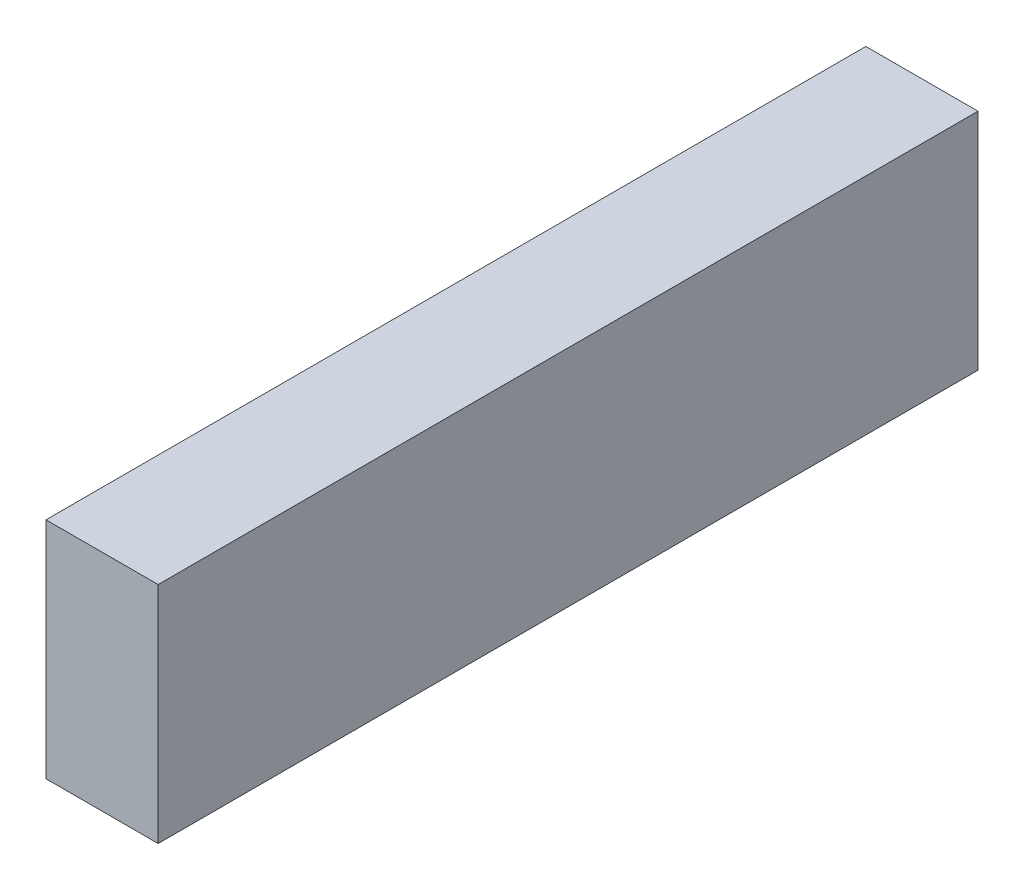
ISO-10303-21;
HEADER;
FILE_DESCRIPTION(('STEP AP214'),'2;1');
FILE_NAME('part.step','',(''),(''),'','','');
FILE_SCHEMA(('AUTOMOTIVE_DESIGN { 1 0 10303 214 1 1 1 1 }'));
ENDSEC;
DATA;
#1=APPLICATION_CONTEXT('core data for automotive mechanical design processes');
#2=APPLICATION_PROTOCOL_DEFINITION('international standard','automotive_design',2000,#1);
#3=PRODUCT_CONTEXT('',#1,'mechanical');
#4=PRODUCT('Part','Part','',(#3));
#5=PRODUCT_RELATED_PRODUCT_CATEGORY('part','',(#4));
#6=PRODUCT_DEFINITION_FORMATION('','',#4);
#7=PRODUCT_DEFINITION_CONTEXT('part definition',#1,'design');
#8=PRODUCT_DEFINITION('design','',#6,#7);
#9=PRODUCT_DEFINITION_SHAPE('','',#8);
#10=(LENGTH_UNIT() NAMED_UNIT(*) SI_UNIT(.MILLI.,.METRE.));
#11=(NAMED_UNIT(*) PLANE_ANGLE_UNIT() SI_UNIT($,.RADIAN.));
#12=(NAMED_UNIT(*) SI_UNIT($,.STERADIAN.) SOLID_ANGLE_UNIT());
#13=UNCERTAINTY_MEASURE_WITH_UNIT(LENGTH_MEASURE(1.E-05),#10,'distance_accuracy_value','');
#14=(GEOMETRIC_REPRESENTATION_CONTEXT(3) GLOBAL_UNCERTAINTY_ASSIGNED_CONTEXT((#13)) GLOBAL_UNIT_ASSIGNED_CONTEXT((#10,
#11,#12)) REPRESENTATION_CONTEXT('',''));
#15=CARTESIAN_POINT('',(0.,0.,0.));
#16=DIRECTION('',(0.,0.,1.));
#17=DIRECTION('',(1.,0.,0.));
#18=AXIS2_PLACEMENT_3D('',#15,#16,#17);
#19=CARTESIAN_POINT('',(-10.,0.,0.));
#20=DIRECTION('',(0.,0.,1.));
#21=DIRECTION('',(1.,0.,0.));
#22=AXIS2_PLACEMENT_3D('',#19,#20,#21);
#23=PLANE('',#22);
#24=DIRECTION('',(0.,-1.,0.));
#25=VECTOR('',#24,1.);
#26=CARTESIAN_POINT('',(0.,0.,0.));
#27=LINE('',#26,#25);
#28=CARTESIAN_POINT('',(0.,20.,0.));
#29=VERTEX_POINT('',#28);
#30=CARTESIAN_POINT('',(0.,0.,0.));
#31=VERTEX_POINT('',#30);
#32=EDGE_CURVE('E107',#29,#31,#27,.T.);
#33=ORIENTED_EDGE('',*,*,#32,.F.);
#34=DIRECTION('',(1.,0.,0.));
#35=VECTOR('',#34,1.);
#36=CARTESIAN_POINT('',(-10.,20.,0.));
#37=LINE('',#36,#35);
#38=CARTESIAN_POINT('',(-10.,20.,0.));
#39=VERTEX_POINT('',#38);
#40=EDGE_CURVE('E11',#39,#29,#37,.T.);
#41=ORIENTED_EDGE('',*,*,#40,.F.);
#42=DIRECTION('',(0.,-1.,0.));
#43=VECTOR('',#42,1.);
#44=CARTESIAN_POINT('',(-10.,0.,0.));
#45=LINE('',#44,#43);
#46=CARTESIAN_POINT('',(-10.,0.,0.));
#47=VERTEX_POINT('',#46);
#48=EDGE_CURVE('E102',#39,#47,#45,.T.);
#49=ORIENTED_EDGE('',*,*,#48,.T.);
#50=DIRECTION('',(1.,0.,0.));
#51=VECTOR('',#50,1.);
#52=CARTESIAN_POINT('',(-10.,0.,0.));
#53=LINE('',#52,#51);
#54=EDGE_CURVE('E46',#47,#31,#53,.T.);
#55=ORIENTED_EDGE('',*,*,#54,.T.);
#56=EDGE_LOOP('',(#33,#41,#49,#55));
#57=FACE_BOUND('',#56,.T.);
#58=ADVANCED_FACE('F43',(#57),#23,.T.);
#59=CARTESIAN_POINT('',(-10.,20.,0.));
#60=DIRECTION('',(0.,1.,0.));
#61=DIRECTION('',(0.,0.,1.));
#62=AXIS2_PLACEMENT_3D('',#59,#60,#61);
#63=PLANE('',#62);
#64=DIRECTION('',(0.,0.,1.));
#65=VECTOR('',#64,1.);
#66=CARTESIAN_POINT('',(0.,20.,0.));
#67=LINE('',#66,#65);
#68=CARTESIAN_POINT('',(0.,20.,-73.1));
#69=VERTEX_POINT('',#68);
#70=EDGE_CURVE('E104',#69,#29,#67,.T.);
#71=ORIENTED_EDGE('',*,*,#70,.F.);
#72=DIRECTION('',(1.,0.,0.));
#73=VECTOR('',#72,1.);
#74=CARTESIAN_POINT('',(-10.,20.,-73.1));
#75=LINE('',#74,#73);
#76=CARTESIAN_POINT('',(-10.,20.,-73.1));
#77=VERTEX_POINT('',#76);
#78=EDGE_CURVE('E55',#77,#69,#75,.T.);
#79=ORIENTED_EDGE('',*,*,#78,.F.);
#80=DIRECTION('',(0.,0.,1.));
#81=VECTOR('',#80,1.);
#82=CARTESIAN_POINT('',(-10.,20.,0.));
#83=LINE('',#82,#81);
#84=EDGE_CURVE('E97',#77,#39,#83,.T.);
#85=ORIENTED_EDGE('',*,*,#84,.T.);
#86=ORIENTED_EDGE('',*,*,#40,.T.);
#87=EDGE_LOOP('',(#71,#79,#85,#86));
#88=FACE_BOUND('',#87,.T.);
#89=ADVANCED_FACE('F117',(#88),#63,.T.);
#90=CARTESIAN_POINT('',(-10.,0.,-73.1));
#91=DIRECTION('',(0.,0.,-1.));
#92=DIRECTION('',(-1.,0.,0.));
#93=AXIS2_PLACEMENT_3D('',#90,#91,#92);
#94=PLANE('',#93);
#95=DIRECTION('',(0.,1.,0.));
#96=VECTOR('',#95,1.);
#97=CARTESIAN_POINT('',(0.,0.,-73.1));
#98=LINE('',#97,#96);
#99=CARTESIAN_POINT('',(0.,0.,-73.1));
#100=VERTEX_POINT('',#99);
#101=EDGE_CURVE('E93',#100,#69,#98,.T.);
#102=ORIENTED_EDGE('',*,*,#101,.F.);
#103=DIRECTION('',(1.,0.,0.));
#104=VECTOR('',#103,1.);
#105=CARTESIAN_POINT('',(-10.,0.,-73.1));
#106=LINE('',#105,#104);
#107=CARTESIAN_POINT('',(-10.,0.,-73.1));
#108=VERTEX_POINT('',#107);
#109=EDGE_CURVE('E88',#108,#100,#106,.T.);
#110=ORIENTED_EDGE('',*,*,#109,.F.);
#111=DIRECTION('',(0.,1.,0.));
#112=VECTOR('',#111,1.);
#113=CARTESIAN_POINT('',(-10.,0.,-73.1));
#114=LINE('',#113,#112);
#115=EDGE_CURVE('E91',#108,#77,#114,.T.);
#116=ORIENTED_EDGE('',*,*,#115,.T.);
#117=ORIENTED_EDGE('',*,*,#78,.T.);
#118=EDGE_LOOP('',(#102,#110,#116,#117));
#119=FACE_BOUND('',#118,.T.);
#120=ADVANCED_FACE('F89',(#119),#94,.T.);
#121=CARTESIAN_POINT('',(-10.,0.,0.));
#122=DIRECTION('',(0.,-1.,0.));
#123=DIRECTION('',(0.,0.,-1.));
#124=AXIS2_PLACEMENT_3D('',#121,#122,#123);
#125=PLANE('',#124);
#126=DIRECTION('',(0.,0.,-1.));
#127=VECTOR('',#126,1.);
#128=CARTESIAN_POINT('',(0.,0.,0.));
#129=LINE('',#128,#127);
#130=EDGE_CURVE('E110',#31,#100,#129,.T.);
#131=ORIENTED_EDGE('',*,*,#130,.F.);
#132=ORIENTED_EDGE('',*,*,#54,.F.);
#133=DIRECTION('',(0.,0.,-1.));
#134=VECTOR('',#133,1.);
#135=CARTESIAN_POINT('',(-10.,0.,0.));
#136=LINE('',#135,#134);
#137=EDGE_CURVE('E100',#47,#108,#136,.T.);
#138=ORIENTED_EDGE('',*,*,#137,.T.);
#139=ORIENTED_EDGE('',*,*,#109,.T.);
#140=EDGE_LOOP('',(#131,#132,#138,#139));
#141=FACE_BOUND('',#140,.T.);
#142=ADVANCED_FACE('F99',(#141),#125,.T.);
#143=CARTESIAN_POINT('',(-10.,0.,0.));
#144=DIRECTION('',(-1.,0.,0.));
#145=DIRECTION('',(0.,0.,1.));
#146=AXIS2_PLACEMENT_3D('',#143,#144,#145);
#147=PLANE('',#146);
#148=ORIENTED_EDGE('',*,*,#48,.F.);
#149=ORIENTED_EDGE('',*,*,#84,.F.);
#150=ORIENTED_EDGE('',*,*,#115,.F.);
#151=ORIENTED_EDGE('',*,*,#137,.F.);
#152=EDGE_LOOP('',(#148,#149,#150,#151));
#153=FACE_BOUND('',#152,.T.);
#154=ADVANCED_FACE('F96',(#153),#147,.T.);
#155=CARTESIAN_POINT('',(0.,0.,0.));
#156=DIRECTION('',(-1.,0.,0.));
#157=DIRECTION('',(0.,0.,1.));
#158=AXIS2_PLACEMENT_3D('',#155,#156,#157);
#159=PLANE('',#158);
#160=ORIENTED_EDGE('',*,*,#32,.T.);
#161=ORIENTED_EDGE('',*,*,#130,.T.);
#162=ORIENTED_EDGE('',*,*,#101,.T.);
#163=ORIENTED_EDGE('',*,*,#70,.T.);
#164=EDGE_LOOP('',(#160,#161,#162,#163));
#165=FACE_BOUND('',#164,.T.);
#166=ADVANCED_FACE('F116',(#165),#159,.F.);
#167=CLOSED_SHELL('',(#58,#89,#120,#142,#154,#166));
#168=MANIFOLD_SOLID_BREP('B2',#167);
#169=ADVANCED_BREP_SHAPE_REPRESENTATION('',(#18,#168),#14);
#170=SHAPE_DEFINITION_REPRESENTATION(#9,#169);
ENDSEC;
END-ISO-10303-21;
